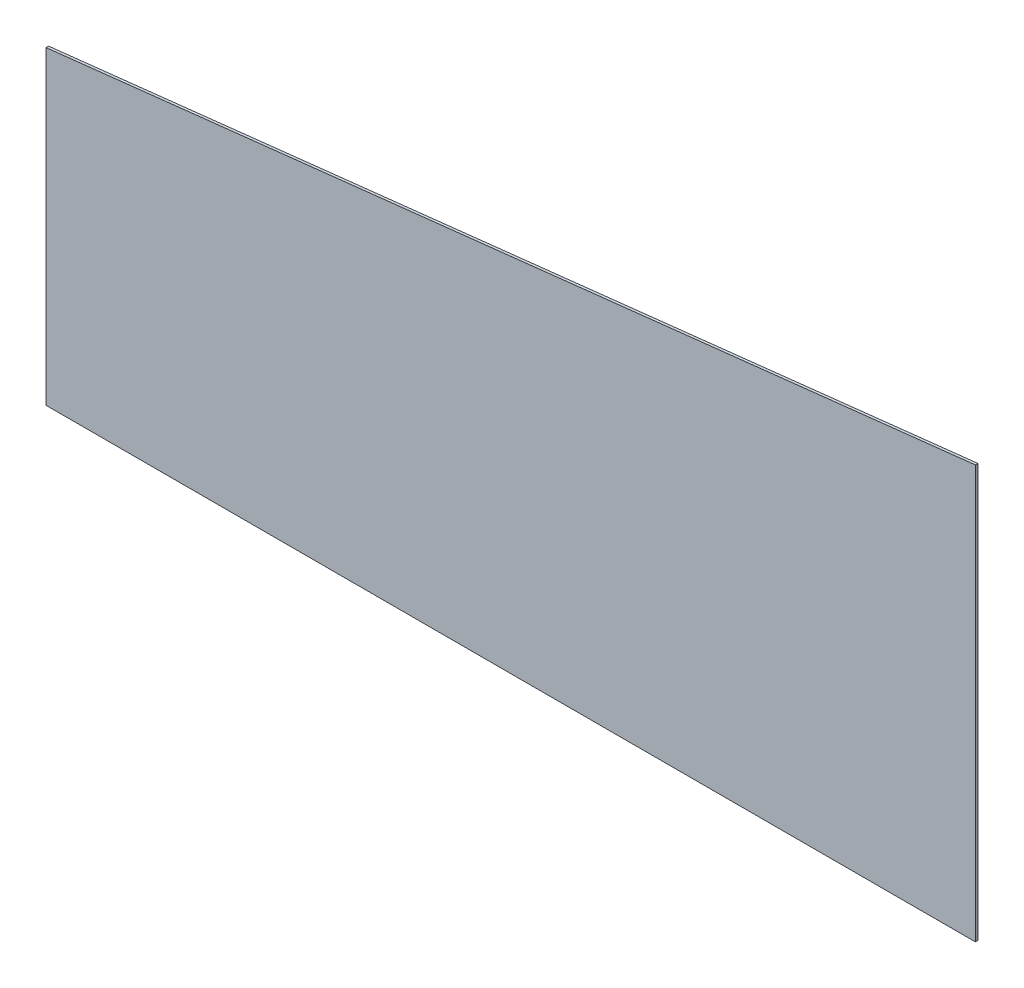
ISO-10303-21;
HEADER;
FILE_DESCRIPTION(('STEP AP214'),'2;1');
FILE_NAME('part.step','',(''),(''),'','','');
FILE_SCHEMA(('AUTOMOTIVE_DESIGN { 1 0 10303 214 1 1 1 1 }'));
ENDSEC;
DATA;
#1=APPLICATION_CONTEXT('core data for automotive mechanical design processes');
#2=APPLICATION_PROTOCOL_DEFINITION('international standard','automotive_design',2000,#1);
#3=PRODUCT_CONTEXT('',#1,'mechanical');
#4=PRODUCT('Part','Part','',(#3));
#5=PRODUCT_RELATED_PRODUCT_CATEGORY('part','',(#4));
#6=PRODUCT_DEFINITION_FORMATION('','',#4);
#7=PRODUCT_DEFINITION_CONTEXT('part definition',#1,'design');
#8=PRODUCT_DEFINITION('design','',#6,#7);
#9=PRODUCT_DEFINITION_SHAPE('','',#8);
#10=(LENGTH_UNIT() NAMED_UNIT(*) SI_UNIT(.MILLI.,.METRE.));
#11=(NAMED_UNIT(*) PLANE_ANGLE_UNIT() SI_UNIT($,.RADIAN.));
#12=(NAMED_UNIT(*) SI_UNIT($,.STERADIAN.) SOLID_ANGLE_UNIT());
#13=UNCERTAINTY_MEASURE_WITH_UNIT(LENGTH_MEASURE(1.E-05),#10,'distance_accuracy_value','');
#14=(GEOMETRIC_REPRESENTATION_CONTEXT(3) GLOBAL_UNCERTAINTY_ASSIGNED_CONTEXT((#13)) GLOBAL_UNIT_ASSIGNED_CONTEXT((#10,
#11,#12)) REPRESENTATION_CONTEXT('',''));
#15=CARTESIAN_POINT('',(0.,0.,0.));
#16=DIRECTION('',(0.,0.,1.));
#17=DIRECTION('',(1.,0.,0.));
#18=AXIS2_PLACEMENT_3D('',#15,#16,#17);
#19=CARTESIAN_POINT('',(900.,400.,5.));
#20=DIRECTION('',(-1.,0.,0.));
#21=DIRECTION('',(0.,0.,1.));
#22=AXIS2_PLACEMENT_3D('',#19,#20,#21);
#23=PLANE('',#22);
#24=DIRECTION('',(0.,1.,0.));
#25=VECTOR('',#24,1.);
#26=CARTESIAN_POINT('',(900.,400.,0.));
#27=LINE('',#26,#25);
#28=CARTESIAN_POINT('',(900.,-400.,0.));
#29=VERTEX_POINT('',#28);
#30=CARTESIAN_POINT('',(900.,400.,0.));
#31=VERTEX_POINT('',#30);
#32=EDGE_CURVE('E95',#29,#31,#27,.T.);
#33=ORIENTED_EDGE('',*,*,#32,.T.);
#34=DIRECTION('',(0.,0.,-1.));
#35=VECTOR('',#34,1.);
#36=CARTESIAN_POINT('',(900.,400.,5.));
#37=LINE('',#36,#35);
#38=CARTESIAN_POINT('',(900.,400.,5.));
#39=VERTEX_POINT('',#38);
#40=EDGE_CURVE('E11',#39,#31,#37,.T.);
#41=ORIENTED_EDGE('',*,*,#40,.F.);
#42=DIRECTION('',(0.,1.,0.));
#43=VECTOR('',#42,1.);
#44=CARTESIAN_POINT('',(900.,400.,5.));
#45=LINE('',#44,#43);
#46=CARTESIAN_POINT('',(900.,-400.,5.));
#47=VERTEX_POINT('',#46);
#48=EDGE_CURVE('E83',#47,#39,#45,.T.);
#49=ORIENTED_EDGE('',*,*,#48,.F.);
#50=DIRECTION('',(0.,0.,-1.));
#51=VECTOR('',#50,1.);
#52=CARTESIAN_POINT('',(900.,-400.,5.));
#53=LINE('',#52,#51);
#54=EDGE_CURVE('E91',#47,#29,#53,.T.);
#55=ORIENTED_EDGE('',*,*,#54,.T.);
#56=EDGE_LOOP('',(#33,#41,#49,#55));
#57=FACE_BOUND('',#56,.T.);
#58=ADVANCED_FACE('F32',(#57),#23,.F.);
#59=CARTESIAN_POINT('',(-900.,200.,5.));
#60=DIRECTION('',(0.110431526074847,-0.993883734673619,0.));
#61=DIRECTION('',(0.993883734673619,0.110431526074847,0.));
#62=AXIS2_PLACEMENT_3D('',#59,#60,#61);
#63=PLANE('',#62);
#64=DIRECTION('',(-0.993883734673619,-0.110431526074847,0.));
#65=VECTOR('',#64,1.);
#66=CARTESIAN_POINT('',(-900.,200.,0.));
#67=LINE('',#66,#65);
#68=CARTESIAN_POINT('',(-900.,200.,0.));
#69=VERTEX_POINT('',#68);
#70=EDGE_CURVE('E87',#31,#69,#67,.T.);
#71=ORIENTED_EDGE('',*,*,#70,.T.);
#72=DIRECTION('',(0.,0.,-1.));
#73=VECTOR('',#72,1.);
#74=CARTESIAN_POINT('',(-900.,200.,5.));
#75=LINE('',#74,#73);
#76=CARTESIAN_POINT('',(-900.,200.,5.));
#77=VERTEX_POINT('',#76);
#78=EDGE_CURVE('E40',#77,#69,#75,.T.);
#79=ORIENTED_EDGE('',*,*,#78,.F.);
#80=DIRECTION('',(-0.993883734673619,-0.110431526074847,0.));
#81=VECTOR('',#80,1.);
#82=CARTESIAN_POINT('',(-900.,200.,5.));
#83=LINE('',#82,#81);
#84=EDGE_CURVE('E78',#39,#77,#83,.T.);
#85=ORIENTED_EDGE('',*,*,#84,.F.);
#86=ORIENTED_EDGE('',*,*,#40,.T.);
#87=EDGE_LOOP('',(#71,#79,#85,#86));
#88=FACE_BOUND('',#87,.T.);
#89=ADVANCED_FACE('F86',(#88),#63,.F.);
#90=CARTESIAN_POINT('',(-900.,200.,5.));
#91=DIRECTION('',(1.,0.,0.));
#92=DIRECTION('',(0.,1.,0.));
#93=AXIS2_PLACEMENT_3D('',#90,#91,#92);
#94=PLANE('',#93);
#95=DIRECTION('',(0.,-1.,0.));
#96=VECTOR('',#95,1.);
#97=CARTESIAN_POINT('',(-900.,200.,0.));
#98=LINE('',#97,#96);
#99=CARTESIAN_POINT('',(-900.,-400.,0.));
#100=VERTEX_POINT('',#99);
#101=EDGE_CURVE('E65',#69,#100,#98,.T.);
#102=ORIENTED_EDGE('',*,*,#101,.T.);
#103=DIRECTION('',(0.,0.,-1.));
#104=VECTOR('',#103,1.);
#105=CARTESIAN_POINT('',(-900.,-400.,5.));
#106=LINE('',#105,#104);
#107=CARTESIAN_POINT('',(-900.,-400.,5.));
#108=VERTEX_POINT('',#107);
#109=EDGE_CURVE('E88',#108,#100,#106,.T.);
#110=ORIENTED_EDGE('',*,*,#109,.F.);
#111=DIRECTION('',(0.,-1.,0.));
#112=VECTOR('',#111,1.);
#113=CARTESIAN_POINT('',(-900.,200.,5.));
#114=LINE('',#113,#112);
#115=EDGE_CURVE('E81',#77,#108,#114,.T.);
#116=ORIENTED_EDGE('',*,*,#115,.F.);
#117=ORIENTED_EDGE('',*,*,#78,.T.);
#118=EDGE_LOOP('',(#102,#110,#116,#117));
#119=FACE_BOUND('',#118,.T.);
#120=ADVANCED_FACE('F89',(#119),#94,.F.);
#121=CARTESIAN_POINT('',(-900.,-400.,5.));
#122=DIRECTION('',(0.,1.,0.));
#123=DIRECTION('',(0.,0.,1.));
#124=AXIS2_PLACEMENT_3D('',#121,#122,#123);
#125=PLANE('',#124);
#126=DIRECTION('',(1.,0.,0.));
#127=VECTOR('',#126,1.);
#128=CARTESIAN_POINT('',(-900.,-400.,0.));
#129=LINE('',#128,#127);
#130=EDGE_CURVE('E71',#100,#29,#129,.T.);
#131=ORIENTED_EDGE('',*,*,#130,.T.);
#132=ORIENTED_EDGE('',*,*,#54,.F.);
#133=DIRECTION('',(1.,0.,0.));
#134=VECTOR('',#133,1.);
#135=CARTESIAN_POINT('',(-900.,-400.,5.));
#136=LINE('',#135,#134);
#137=EDGE_CURVE('E48',#108,#47,#136,.T.);
#138=ORIENTED_EDGE('',*,*,#137,.F.);
#139=ORIENTED_EDGE('',*,*,#109,.T.);
#140=EDGE_LOOP('',(#131,#132,#138,#139));
#141=FACE_BOUND('',#140,.T.);
#142=ADVANCED_FACE('F102',(#141),#125,.F.);
#143=CARTESIAN_POINT('',(0.,0.,5.));
#144=DIRECTION('',(0.,0.,1.));
#145=DIRECTION('',(1.,0.,0.));
#146=AXIS2_PLACEMENT_3D('',#143,#144,#145);
#147=PLANE('',#146);
#148=ORIENTED_EDGE('',*,*,#48,.T.);
#149=ORIENTED_EDGE('',*,*,#84,.T.);
#150=ORIENTED_EDGE('',*,*,#115,.T.);
#151=ORIENTED_EDGE('',*,*,#137,.T.);
#152=EDGE_LOOP('',(#148,#149,#150,#151));
#153=FACE_BOUND('',#152,.T.);
#154=ADVANCED_FACE('F79',(#153),#147,.T.);
#155=CARTESIAN_POINT('',(0.,0.,0.));
#156=DIRECTION('',(0.,0.,1.));
#157=DIRECTION('',(1.,0.,0.));
#158=AXIS2_PLACEMENT_3D('',#155,#156,#157);
#159=PLANE('',#158);
#160=ORIENTED_EDGE('',*,*,#32,.F.);
#161=ORIENTED_EDGE('',*,*,#130,.F.);
#162=ORIENTED_EDGE('',*,*,#101,.F.);
#163=ORIENTED_EDGE('',*,*,#70,.F.);
#164=EDGE_LOOP('',(#160,#161,#162,#163));
#165=FACE_BOUND('',#164,.T.);
#166=ADVANCED_FACE('F105',(#165),#159,.F.);
#167=CLOSED_SHELL('',(#58,#89,#120,#142,#154,#166));
#168=MANIFOLD_SOLID_BREP('B2',#167);
#169=ADVANCED_BREP_SHAPE_REPRESENTATION('',(#18,#168),#14);
#170=SHAPE_DEFINITION_REPRESENTATION(#9,#169);
ENDSEC;
END-ISO-10303-21;
